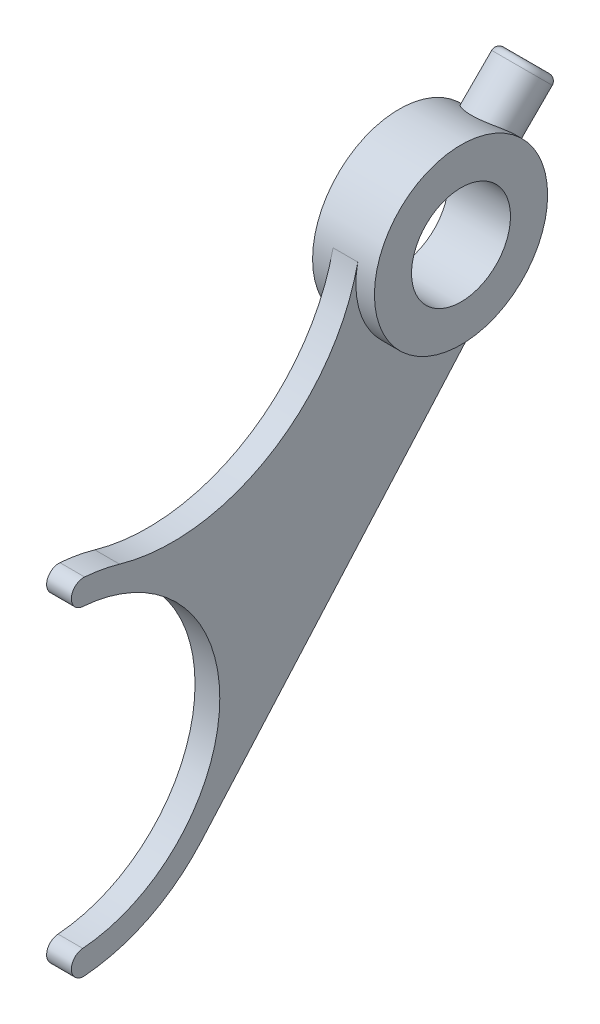
ISO-10303-21;
HEADER;
FILE_DESCRIPTION(('STEP AP214'),'2;1');
FILE_NAME('part.step','',(''),(''),'','','');
FILE_SCHEMA(('AUTOMOTIVE_DESIGN { 1 0 10303 214 1 1 1 1 }'));
ENDSEC;
DATA;
#1=APPLICATION_CONTEXT('core data for automotive mechanical design processes');
#2=APPLICATION_PROTOCOL_DEFINITION('international standard','automotive_design',2000,#1);
#3=PRODUCT_CONTEXT('',#1,'mechanical');
#4=PRODUCT('Part','Part','',(#3));
#5=PRODUCT_RELATED_PRODUCT_CATEGORY('part','',(#4));
#6=PRODUCT_DEFINITION_FORMATION('','',#4);
#7=PRODUCT_DEFINITION_CONTEXT('part definition',#1,'design');
#8=PRODUCT_DEFINITION('design','',#6,#7);
#9=PRODUCT_DEFINITION_SHAPE('','',#8);
#10=(LENGTH_UNIT() NAMED_UNIT(*) SI_UNIT(.MILLI.,.METRE.));
#11=(NAMED_UNIT(*) PLANE_ANGLE_UNIT() SI_UNIT($,.RADIAN.));
#12=(NAMED_UNIT(*) SI_UNIT($,.STERADIAN.) SOLID_ANGLE_UNIT());
#13=UNCERTAINTY_MEASURE_WITH_UNIT(LENGTH_MEASURE(1.E-05),#10,'distance_accuracy_value','');
#14=(GEOMETRIC_REPRESENTATION_CONTEXT(3) GLOBAL_UNCERTAINTY_ASSIGNED_CONTEXT((#13)) GLOBAL_UNIT_ASSIGNED_CONTEXT((#10,
#11,#12)) REPRESENTATION_CONTEXT('',''));
#15=CARTESIAN_POINT('',(0.,0.,0.));
#16=DIRECTION('',(0.,0.,1.));
#17=DIRECTION('',(1.,0.,0.));
#18=AXIS2_PLACEMENT_3D('',#15,#16,#17);
#19=CARTESIAN_POINT('',(1.2,11.9644443662914,-0.923076923076999));
#20=CARTESIAN_POINT('',(1.13333333333334,11.9644443662914,-0.923076923076999));
#21=CARTESIAN_POINT('',(1.06666666666665,11.9644443662914,-0.923076923077153));
#22=CARTESIAN_POINT('',(0.333333333333461,11.9644443662914,-0.923076923077153));
#23=CARTESIAN_POINT('',(-0.333333333333171,11.9644443662914,-0.923076923077153));
#24=CARTESIAN_POINT('',(-1.06666666666668,11.9644443662914,-0.923076923077153));
#25=CARTESIAN_POINT('',(-1.13333333333332,11.9644443662914,-0.923076923076999));
#26=CARTESIAN_POINT('',(-1.2,11.9644443662914,-0.923076923076999));
#27=CARTESIAN_POINT('',(1.2,12.0157264175735,-0.258385569394107));
#28=CARTESIAN_POINT('',(1.13333333333334,12.0157264175735,-0.258385569394085));
#29=CARTESIAN_POINT('',(1.06666666666666,12.0157264175734,-0.258385569394171));
#30=CARTESIAN_POINT('',(0.333333333333389,12.0157264175734,-0.25838556939437));
#31=CARTESIAN_POINT('',(-0.333333333333171,12.0157264175734,-0.258385569394189));
#32=CARTESIAN_POINT('',(-1.06666666666668,12.0157264175734,-0.258385569394189));
#33=CARTESIAN_POINT('',(-1.13333333333332,12.0157264175735,-0.258385569394107));
#34=CARTESIAN_POINT('',(-1.2,12.0157264175735,-0.258385569394107));
#35=CARTESIAN_POINT('',(1.2,12.5783474969382,0.534017084248035));
#36=CARTESIAN_POINT('',(1.1333333333333,12.5783474969383,0.534017084248104));
#37=CARTESIAN_POINT('',(1.0666666666667,12.5783474969382,0.534017084248246));
#38=CARTESIAN_POINT('',(0.333333333332955,12.5783474969376,0.534017084247451));
#39=CARTESIAN_POINT('',(-0.333333333333171,12.5783474969381,0.534017084248174));
#40=CARTESIAN_POINT('',(-1.06666666666668,12.5783474969381,0.534017084248174));
#41=CARTESIAN_POINT('',(-1.13333333333332,12.5783474969382,0.534017084248035));
#42=CARTESIAN_POINT('',(-1.2,12.5783474969382,0.534017084248035));
#43=CARTESIAN_POINT('',(1.2,13.5753845274625,0.457094007324937));
#44=CARTESIAN_POINT('',(1.13333333333324,13.5753845274627,0.457094007324946));
#45=CARTESIAN_POINT('',(1.06666666666679,13.5753845274629,0.45709400732505));
#46=CARTESIAN_POINT('',(0.333333333332088,13.575384527461,0.45709400732489));
#47=CARTESIAN_POINT('',(-0.333333333333171,13.5753845274627,0.457094007325035));
#48=CARTESIAN_POINT('',(-1.06666666666668,13.5753845274627,0.457094007325035));
#49=CARTESIAN_POINT('',(-1.13333333333332,13.5753845274625,0.457094007324937));
#50=CARTESIAN_POINT('',(-1.2,13.5753845274625,0.457094007324937));
#51=CARTESIAN_POINT('',(1.2,14.0098004786221,-0.412231723240295));
#52=CARTESIAN_POINT('',(1.13333333333321,14.0098004786222,-0.412231723240382));
#53=CARTESIAN_POINT('',(1.06666666666683,14.0098004786222,-0.412231723240533));
#54=CARTESIAN_POINT('',(0.333333333331654,14.0098004786216,-0.41223172323954));
#55=CARTESIAN_POINT('',(-0.333333333333171,14.0098004786222,-0.412231723240443));
#56=CARTESIAN_POINT('',(-1.06666666666668,14.0098004786222,-0.412231723240443));
#57=CARTESIAN_POINT('',(-1.13333333333332,14.0098004786221,-0.412231723240295));
#58=CARTESIAN_POINT('',(-1.2,14.0098004786221,-0.412231723240295));
#59=CARTESIAN_POINT('',(1.2,13.95851842734,-1.07692307692318));
#60=CARTESIAN_POINT('',(1.13333333333321,13.95851842734,-1.07692307692328));
#61=CARTESIAN_POINT('',(1.06666666666683,13.95851842734,-1.07692307692349));
#62=CARTESIAN_POINT('',(0.333333333331727,13.9585184273401,-1.07692307692238));
#63=CARTESIAN_POINT('',(-0.333333333333171,13.95851842734,-1.07692307692339));
#64=CARTESIAN_POINT('',(-1.06666666666668,13.95851842734,-1.07692307692339));
#65=CARTESIAN_POINT('',(-1.13333333333332,13.95851842734,-1.07692307692318));
#66=CARTESIAN_POINT('',(-1.2,13.95851842734,-1.07692307692318));
#67=(BOUNDED_SURFACE() B_SPLINE_SURFACE(5,3,((#19,#20,#21,#22,#23,#24,#25,#26),(#27,#28,#29,#30,
#31,#32,#33,#34),(#35,#36,#37,#38,#39,#40,#41,#42),(#43,#44,#45,#46,#47,#48,#49,#50),(#51,#52,
#53,#54,#55,#56,#57,#58),(#59,#60,#61,#62,#63,#64,#65,#66)),.UNSPECIFIED.,.F.,.F.,
.F.) B_SPLINE_SURFACE_WITH_KNOTS((6,6),(4,2,2,4),(0.,1.),(-0.1,0.,1.,1.1),
.UNSPECIFIED.) GEOMETRIC_REPRESENTATION_ITEM() RATIONAL_B_SPLINE_SURFACE(((1.,1.,1.,1.,1.,1.,1.,
1.),(0.599999999999976,0.599999999999976,0.599999999999927,0.599999999999927,0.599999999999927,
0.599999999999927,0.599999999999976,0.599999999999976),(0.399999999999964,0.399999999999964,
0.399999999999891,0.399999999999891,0.399999999999891,0.399999999999891,0.399999999999964,
0.399999999999964),(0.399999999999964,0.399999999999964,0.399999999999891,0.399999999999891,
0.399999999999891,0.399999999999891,0.399999999999964,0.399999999999964),(0.599999999999976,
0.599999999999976,0.599999999999927,0.599999999999927,0.599999999999927,0.599999999999927,
0.599999999999976,0.599999999999976),(1.,1.,1.,1.,1.,1.,1.,1.))) REPRESENTATION_ITEM('') SURFACE());
#68=CARTESIAN_POINT('',(-1.2,11.9644443662914,-0.923076923076999));
#69=CARTESIAN_POINT('',(-1.13333333333332,11.9644443662914,-0.923076923076999));
#70=CARTESIAN_POINT('',(-1.06666666666668,11.9644443662914,-0.923076923077153));
#71=CARTESIAN_POINT('',(-0.333333333333171,11.9644443662914,-0.923076923077153));
#72=CARTESIAN_POINT('',(0.333333333333461,11.9644443662914,-0.923076923077153));
#73=CARTESIAN_POINT('',(1.06666666666665,11.9644443662914,-0.923076923077153));
#74=CARTESIAN_POINT('',(1.13333333333334,11.9644443662914,-0.923076923076999));
#75=CARTESIAN_POINT('',(1.2,11.9644443662914,-0.923076923076999));
#76=(BOUNDED_CURVE() B_SPLINE_CURVE(3,(#68,#69,#70,#71,#72,#73,#74,#75),.UNSPECIFIED.,.F.,
.F.) B_SPLINE_CURVE_WITH_KNOTS((4,2,2,4),(-0.1,0.,1.,1.1),
.UNSPECIFIED.) CURVE() GEOMETRIC_REPRESENTATION_ITEM() RATIONAL_B_SPLINE_CURVE((1.,1.,1.,1.,1.,
1.,1.,1.)) REPRESENTATION_ITEM(''));
#77=CARTESIAN_POINT('',(1.,11.9644443662914,-0.923076923077153));
#78=VERTEX_POINT('',#77);
#79=CARTESIAN_POINT('',(-1.,11.9644443662914,-0.923076923077153));
#80=VERTEX_POINT('',#79);
#81=EDGE_CURVE('E435',#78,#80,#76,.F.);
#82=CARTESIAN_POINT('',(1.,11.9644443662914,-0.923076923077153));
#83=CARTESIAN_POINT('',(1.,12.0157264175734,-0.258385569394189));
#84=CARTESIAN_POINT('',(1.,12.5783474969381,0.534017084248174));
#85=CARTESIAN_POINT('',(1.,13.5753845274627,0.457094007325035));
#86=CARTESIAN_POINT('',(1.,14.0098004786222,-0.412231723240443));
#87=CARTESIAN_POINT('',(1.,13.95851842734,-1.07692307692339));
#88=(BOUNDED_CURVE() B_SPLINE_CURVE(5,(#82,#83,#84,#85,#86,#87),.UNSPECIFIED.,.F.,
.F.) B_SPLINE_CURVE_WITH_KNOTS((6,6),(0.,1.),
.UNSPECIFIED.) CURVE() GEOMETRIC_REPRESENTATION_ITEM() RATIONAL_B_SPLINE_CURVE((1.,
0.599999999999927,0.399999999999891,0.399999999999891,0.599999999999927,1.)) REPRESENTATION_ITEM(''));
#89=CARTESIAN_POINT('',(1.,13.95851842734,-1.07692307692339));
#90=VERTEX_POINT('',#89);
#91=EDGE_CURVE('E197',#90,#78,#88,.F.);
#92=CARTESIAN_POINT('',(1.2,13.95851842734,-1.07692307692318));
#93=CARTESIAN_POINT('',(1.13333333333321,13.95851842734,-1.07692307692328));
#94=CARTESIAN_POINT('',(1.06666666666683,13.95851842734,-1.07692307692349));
#95=CARTESIAN_POINT('',(0.333333333331727,13.9585184273401,-1.07692307692238));
#96=CARTESIAN_POINT('',(-0.333333333333171,13.95851842734,-1.07692307692339));
#97=CARTESIAN_POINT('',(-1.06666666666668,13.95851842734,-1.07692307692339));
#98=CARTESIAN_POINT('',(-1.13333333333332,13.95851842734,-1.07692307692318));
#99=CARTESIAN_POINT('',(-1.2,13.95851842734,-1.07692307692318));
#100=(BOUNDED_CURVE() B_SPLINE_CURVE(3,(#92,#93,#94,#95,#96,#97,#98,#99),.UNSPECIFIED.,.F.,
.F.) B_SPLINE_CURVE_WITH_KNOTS((4,2,2,4),(-0.1,0.,1.,1.1),
.UNSPECIFIED.) CURVE() GEOMETRIC_REPRESENTATION_ITEM() RATIONAL_B_SPLINE_CURVE((1.,1.,1.,1.,1.,
1.,1.,1.)) REPRESENTATION_ITEM(''));
#101=CARTESIAN_POINT('',(-1.,13.95851842734,-1.07692307692339));
#102=VERTEX_POINT('',#101);
#103=EDGE_CURVE('E434',#102,#90,#100,.F.);
#104=CARTESIAN_POINT('',(-1.,13.95851842734,-1.07692307692339));
#105=CARTESIAN_POINT('',(-1.,14.0098004786222,-0.412231723240443));
#106=CARTESIAN_POINT('',(-1.,13.5753845274627,0.457094007325035));
#107=CARTESIAN_POINT('',(-1.,12.5783474969381,0.534017084248174));
#108=CARTESIAN_POINT('',(-1.,12.0157264175734,-0.258385569394189));
#109=CARTESIAN_POINT('',(-1.,11.9644443662914,-0.923076923077153));
#110=(BOUNDED_CURVE() B_SPLINE_CURVE(5,(#104,#105,#106,#107,#108,#109),.UNSPECIFIED.,.F.,
.F.) B_SPLINE_CURVE_WITH_KNOTS((6,6),(0.,1.),
.UNSPECIFIED.) CURVE() GEOMETRIC_REPRESENTATION_ITEM() RATIONAL_B_SPLINE_CURVE((1.,
0.599999999999927,0.399999999999891,0.399999999999891,0.599999999999927,1.)) REPRESENTATION_ITEM(''));
#111=EDGE_CURVE('E12',#80,#102,#110,.F.);
#112=ORIENTED_EDGE('',*,*,#81,.F.);
#113=ORIENTED_EDGE('',*,*,#91,.F.);
#114=ORIENTED_EDGE('',*,*,#103,.F.);
#115=ORIENTED_EDGE('',*,*,#111,.F.);
#116=EDGE_LOOP('',(#112,#113,#114,#115));
#117=FACE_BOUND('',#116,.T.);
#118=ADVANCED_FACE('F181',(#117),#67,.T.);
#119=CARTESIAN_POINT('',(1.2,-13.95851842734,-1.07692307692308));
#120=CARTESIAN_POINT('',(1.13333333333334,-13.95851842734,-1.07692307692308));
#121=CARTESIAN_POINT('',(1.06666666666665,-13.95851842734,-1.07692307692308));
#122=CARTESIAN_POINT('',(0.333333333333461,-13.95851842734,-1.07692307692308));
#123=CARTESIAN_POINT('',(-0.333333333333171,-13.95851842734,-1.07692307692308));
#124=CARTESIAN_POINT('',(-1.06666666666668,-13.95851842734,-1.07692307692308));
#125=CARTESIAN_POINT('',(-1.13333333333332,-13.95851842734,-1.07692307692308));
#126=CARTESIAN_POINT('',(-1.2,-13.95851842734,-1.07692307692308));
#127=CARTESIAN_POINT('',(1.2,-14.0098004786221,-0.412231723240223));
#128=CARTESIAN_POINT('',(1.13333333333334,-14.0098004786221,-0.412231723240223));
#129=CARTESIAN_POINT('',(1.06666666666665,-14.0098004786221,-0.412231723240223));
#130=CARTESIAN_POINT('',(0.333333333333461,-14.0098004786221,-0.412231723240223));
#131=CARTESIAN_POINT('',(-0.333333333333171,-14.0098004786221,-0.412231723240223));
#132=CARTESIAN_POINT('',(-1.06666666666668,-14.0098004786221,-0.412231723240223));
#133=CARTESIAN_POINT('',(-1.13333333333332,-14.0098004786221,-0.412231723240223));
#134=CARTESIAN_POINT('',(-1.2,-14.0098004786221,-0.412231723240223));
#135=CARTESIAN_POINT('',(1.2,-13.5753845274625,0.457094007324897));
#136=CARTESIAN_POINT('',(1.13333333333334,-13.5753845274625,0.457094007324897));
#137=CARTESIAN_POINT('',(1.06666666666665,-13.5753845274625,0.457094007324897));
#138=CARTESIAN_POINT('',(0.333333333333461,-13.5753845274625,0.457094007324897));
#139=CARTESIAN_POINT('',(-0.333333333333171,-13.5753845274625,0.457094007324897));
#140=CARTESIAN_POINT('',(-1.06666666666668,-13.5753845274625,0.457094007324897));
#141=CARTESIAN_POINT('',(-1.13333333333332,-13.5753845274625,0.457094007324897));
#142=CARTESIAN_POINT('',(-1.2,-13.5753845274625,0.457094007324897));
#143=CARTESIAN_POINT('',(1.2,-12.5783474969382,0.534017084247975));
#144=CARTESIAN_POINT('',(1.13333333333334,-12.5783474969382,0.534017084247975));
#145=CARTESIAN_POINT('',(1.06666666666665,-12.5783474969382,0.534017084247975));
#146=CARTESIAN_POINT('',(0.333333333333461,-12.5783474969382,0.534017084247975));
#147=CARTESIAN_POINT('',(-0.333333333333171,-12.5783474969382,0.534017084247975));
#148=CARTESIAN_POINT('',(-1.06666666666668,-12.5783474969382,0.534017084247975));
#149=CARTESIAN_POINT('',(-1.13333333333332,-12.5783474969382,0.534017084247975));
#150=CARTESIAN_POINT('',(-1.2,-12.5783474969382,0.534017084247975));
#151=CARTESIAN_POINT('',(1.2,-12.0157264175735,-0.258385569394068));
#152=CARTESIAN_POINT('',(1.13333333333334,-12.0157264175735,-0.258385569394068));
#153=CARTESIAN_POINT('',(1.06666666666665,-12.0157264175735,-0.258385569394068));
#154=CARTESIAN_POINT('',(0.333333333333461,-12.0157264175735,-0.258385569394068));
#155=CARTESIAN_POINT('',(-0.333333333333171,-12.0157264175735,-0.258385569394068));
#156=CARTESIAN_POINT('',(-1.06666666666668,-12.0157264175735,-0.258385569394068));
#157=CARTESIAN_POINT('',(-1.13333333333332,-12.0157264175735,-0.258385569394068));
#158=CARTESIAN_POINT('',(-1.2,-12.0157264175735,-0.258385569394068));
#159=CARTESIAN_POINT('',(1.2,-11.9644443662914,-0.923076923076928));
#160=CARTESIAN_POINT('',(1.13333333333334,-11.9644443662914,-0.923076923076928));
#161=CARTESIAN_POINT('',(1.06666666666665,-11.9644443662914,-0.923076923076928));
#162=CARTESIAN_POINT('',(0.333333333333461,-11.9644443662914,-0.923076923076928));
#163=CARTESIAN_POINT('',(-0.333333333333171,-11.9644443662914,-0.923076923076928));
#164=CARTESIAN_POINT('',(-1.06666666666668,-11.9644443662914,-0.923076923076928));
#165=CARTESIAN_POINT('',(-1.13333333333332,-11.9644443662914,-0.923076923076928));
#166=CARTESIAN_POINT('',(-1.2,-11.9644443662914,-0.923076923076928));
#167=(BOUNDED_SURFACE() B_SPLINE_SURFACE(5,3,((#119,#120,#121,#122,#123,#124,#125,#126),(#127,
#128,#129,#130,#131,#132,#133,#134),(#135,#136,#137,#138,#139,#140,#141,#142),(#143,#144,#145,
#146,#147,#148,#149,#150),(#151,#152,#153,#154,#155,#156,#157,#158),(#159,#160,#161,#162,#163,
#164,#165,#166)),.UNSPECIFIED.,.F.,.F.,.F.) B_SPLINE_SURFACE_WITH_KNOTS((6,6),(4,2,2,4),(0.,1.),
(-0.1,0.,1.,1.1),.UNSPECIFIED.) GEOMETRIC_REPRESENTATION_ITEM() RATIONAL_B_SPLINE_SURFACE(((1.,
1.,1.,1.,1.,1.,1.,1.),(0.599999999999998,0.599999999999998,0.599999999999998,0.599999999999998,
0.599999999999998,0.599999999999998,0.599999999999998,0.599999999999998),(0.399999999999997,
0.399999999999997,0.399999999999997,0.399999999999997,0.399999999999997,0.399999999999997,
0.399999999999997,0.399999999999997),(0.399999999999997,0.399999999999997,0.399999999999997,
0.399999999999997,0.399999999999997,0.399999999999997,0.399999999999997,0.399999999999997),
(0.599999999999998,0.599999999999998,0.599999999999998,0.599999999999998,0.599999999999998,
0.599999999999998,0.599999999999998,0.599999999999998),(1.,1.,1.,1.,1.,1.,1.,1.))) REPRESENTATION_ITEM('') SURFACE());
#168=CARTESIAN_POINT('',(-1.2,-13.95851842734,-1.07692307692308));
#169=CARTESIAN_POINT('',(-1.13333333333332,-13.95851842734,-1.07692307692308));
#170=CARTESIAN_POINT('',(-1.06666666666668,-13.95851842734,-1.07692307692308));
#171=CARTESIAN_POINT('',(-0.333333333333171,-13.95851842734,-1.07692307692308));
#172=CARTESIAN_POINT('',(0.333333333333461,-13.95851842734,-1.07692307692308));
#173=CARTESIAN_POINT('',(1.06666666666665,-13.95851842734,-1.07692307692308));
#174=CARTESIAN_POINT('',(1.13333333333334,-13.95851842734,-1.07692307692308));
#175=CARTESIAN_POINT('',(1.2,-13.95851842734,-1.07692307692308));
#176=(BOUNDED_CURVE() B_SPLINE_CURVE(3,(#168,#169,#170,#171,#172,#173,#174,#175),.UNSPECIFIED.,
.F.,.F.) B_SPLINE_CURVE_WITH_KNOTS((4,2,2,4),(-0.1,0.,1.,1.1),
.UNSPECIFIED.) CURVE() GEOMETRIC_REPRESENTATION_ITEM() RATIONAL_B_SPLINE_CURVE((1.,1.,1.,1.,1.,
1.,1.,1.)) REPRESENTATION_ITEM(''));
#177=CARTESIAN_POINT('',(1.,-13.95851842734,-1.07692307692308));
#178=VERTEX_POINT('',#177);
#179=CARTESIAN_POINT('',(-1.,-13.95851842734,-1.07692307692308));
#180=VERTEX_POINT('',#179);
#181=EDGE_CURVE('E305',#178,#180,#176,.F.);
#182=CARTESIAN_POINT('',(1.,-13.95851842734,-1.07692307692308));
#183=CARTESIAN_POINT('',(1.,-14.0098004786221,-0.412231723240223));
#184=CARTESIAN_POINT('',(1.,-13.5753845274625,0.457094007324897));
#185=CARTESIAN_POINT('',(1.,-12.5783474969382,0.534017084247975));
#186=CARTESIAN_POINT('',(1.,-12.0157264175735,-0.258385569394068));
#187=CARTESIAN_POINT('',(1.,-11.9644443662914,-0.923076923076928));
#188=(BOUNDED_CURVE() B_SPLINE_CURVE(5,(#182,#183,#184,#185,#186,#187),.UNSPECIFIED.,.F.,
.F.) B_SPLINE_CURVE_WITH_KNOTS((6,6),(0.,1.),
.UNSPECIFIED.) CURVE() GEOMETRIC_REPRESENTATION_ITEM() RATIONAL_B_SPLINE_CURVE((1.,
0.599999999999998,0.399999999999997,0.399999999999997,0.599999999999998,1.)) REPRESENTATION_ITEM(''));
#189=CARTESIAN_POINT('',(1.,-11.9644443662914,-0.923076923076928));
#190=VERTEX_POINT('',#189);
#191=EDGE_CURVE('E704',#190,#178,#188,.F.);
#192=CARTESIAN_POINT('',(1.2,-11.9644443662914,-0.923076923076928));
#193=CARTESIAN_POINT('',(1.13333333333334,-11.9644443662914,-0.923076923076928));
#194=CARTESIAN_POINT('',(1.06666666666665,-11.9644443662914,-0.923076923076928));
#195=CARTESIAN_POINT('',(0.333333333333461,-11.9644443662914,-0.923076923076928));
#196=CARTESIAN_POINT('',(-0.333333333333171,-11.9644443662914,-0.923076923076928));
#197=CARTESIAN_POINT('',(-1.06666666666668,-11.9644443662914,-0.923076923076928));
#198=CARTESIAN_POINT('',(-1.13333333333332,-11.9644443662914,-0.923076923076928));
#199=CARTESIAN_POINT('',(-1.2,-11.9644443662914,-0.923076923076928));
#200=(BOUNDED_CURVE() B_SPLINE_CURVE(3,(#192,#193,#194,#195,#196,#197,#198,#199),.UNSPECIFIED.,
.F.,.F.) B_SPLINE_CURVE_WITH_KNOTS((4,2,2,4),(-0.1,0.,1.,1.1),
.UNSPECIFIED.) CURVE() GEOMETRIC_REPRESENTATION_ITEM() RATIONAL_B_SPLINE_CURVE((1.,1.,1.,1.,1.,
1.,1.,1.)) REPRESENTATION_ITEM(''));
#201=CARTESIAN_POINT('',(-1.,-11.9644443662914,-0.923076923076928));
#202=VERTEX_POINT('',#201);
#203=EDGE_CURVE('E361',#202,#190,#200,.F.);
#204=CARTESIAN_POINT('',(-1.,-11.9644443662914,-0.923076923076928));
#205=CARTESIAN_POINT('',(-1.,-12.0157264175735,-0.258385569394068));
#206=CARTESIAN_POINT('',(-1.,-12.5783474969382,0.534017084247975));
#207=CARTESIAN_POINT('',(-1.,-13.5753845274625,0.457094007324897));
#208=CARTESIAN_POINT('',(-1.,-14.0098004786221,-0.412231723240223));
#209=CARTESIAN_POINT('',(-1.,-13.95851842734,-1.07692307692308));
#210=(BOUNDED_CURVE() B_SPLINE_CURVE(5,(#204,#205,#206,#207,#208,#209),.UNSPECIFIED.,.F.,
.F.) B_SPLINE_CURVE_WITH_KNOTS((6,6),(0.,1.),
.UNSPECIFIED.) CURVE() GEOMETRIC_REPRESENTATION_ITEM() RATIONAL_B_SPLINE_CURVE((1.,
0.599999999999998,0.399999999999997,0.399999999999997,0.599999999999998,1.)) REPRESENTATION_ITEM(''));
#211=EDGE_CURVE('E421',#180,#202,#210,.F.);
#212=ORIENTED_EDGE('',*,*,#181,.F.);
#213=ORIENTED_EDGE('',*,*,#191,.F.);
#214=ORIENTED_EDGE('',*,*,#203,.F.);
#215=ORIENTED_EDGE('',*,*,#211,.F.);
#216=EDGE_LOOP('',(#212,#213,#214,#215));
#217=FACE_BOUND('',#216,.T.);
#218=ADVANCED_FACE('F389',(#217),#167,.T.);
#219=CARTESIAN_POINT('',(2.,34.5281745930521,-34.528174593052));
#220=DIRECTION('',(0.,0.707106781186549,-0.707106781186546));
#221=DIRECTION('',(0.,0.707106781186546,0.707106781186549));
#222=AXIS2_PLACEMENT_3D('',#219,#220,#221);
#223=PLANE('',#222);
#224=CARTESIAN_POINT('',(0.,31.278174593052,-37.778174593052));
#225=DIRECTION('',(0.,0.707106781186549,-0.707106781186546));
#226=DIRECTION('',(0.,0.707106781186546,0.707106781186549));
#227=AXIS2_PLACEMENT_3D('',#224,#225,#226);
#228=CIRCLE('',#227,1.5);
#229=CARTESIAN_POINT('',(0.,32.3388347648319,-36.7175144212722));
#230=VERTEX_POINT('',#229);
#231=EDGE_CURVE('E299',#230,#230,#228,.T.);
#232=ORIENTED_EDGE('',*,*,#231,.T.);
#233=EDGE_LOOP('',(#232));
#234=FACE_BOUND('',#233,.T.);
#235=ADVANCED_FACE('F377',(#234),#223,.T.);
#236=CARTESIAN_POINT('',(1.,0.,0.));
#237=DIRECTION('',(-1.,0.,0.));
#238=DIRECTION('',(0.,0.,1.));
#239=AXIS2_PLACEMENT_3D('',#236,#237,#238);
#240=CYLINDRICAL_SURFACE('',#239,12.);
#241=CARTESIAN_POINT('',(1.,0.,0.));
#242=DIRECTION('',(1.,0.,0.));
#243=DIRECTION('',(0.,0.,-1.));
#244=AXIS2_PLACEMENT_3D('',#241,#242,#243);
#245=CIRCLE('',#244,12.);
#246=EDGE_CURVE('E285',#190,#78,#245,.T.);
#247=ORIENTED_EDGE('',*,*,#246,.T.);
#248=ORIENTED_EDGE('',*,*,#81,.T.);
#249=CARTESIAN_POINT('',(-1.,0.,0.));
#250=DIRECTION('',(1.,0.,0.));
#251=DIRECTION('',(0.,0.,-1.));
#252=AXIS2_PLACEMENT_3D('',#249,#250,#251);
#253=CIRCLE('',#252,12.);
#254=EDGE_CURVE('E309',#202,#80,#253,.T.);
#255=ORIENTED_EDGE('',*,*,#254,.F.);
#256=ORIENTED_EDGE('',*,*,#203,.T.);
#257=EDGE_LOOP('',(#247,#248,#255,#256));
#258=FACE_BOUND('',#257,.T.);
#259=ADVANCED_FACE('F366',(#258),#240,.F.);
#260=CARTESIAN_POINT('',(1.,0.,0.));
#261=DIRECTION('',(-1.,0.,0.));
#262=DIRECTION('',(0.,0.,1.));
#263=AXIS2_PLACEMENT_3D('',#260,#261,#262);
#264=CYLINDRICAL_SURFACE('',#263,14.);
#265=CARTESIAN_POINT('',(1.,0.,0.));
#266=DIRECTION('',(1.,0.,0.));
#267=DIRECTION('',(0.,0.,-1.));
#268=AXIS2_PLACEMENT_3D('',#265,#266,#267);
#269=CIRCLE('',#268,14.);
#270=CARTESIAN_POINT('',(1.,-9.24785059764497,-10.5108163014886));
#271=VERTEX_POINT('',#270);
#272=EDGE_CURVE('E313',#178,#271,#269,.T.);
#273=ORIENTED_EDGE('',*,*,#272,.F.);
#274=ORIENTED_EDGE('',*,*,#181,.T.);
#275=CARTESIAN_POINT('',(-1.,0.,0.));
#276=DIRECTION('',(1.,0.,0.));
#277=DIRECTION('',(0.,0.,-1.));
#278=AXIS2_PLACEMENT_3D('',#275,#276,#277);
#279=CIRCLE('',#278,14.);
#280=CARTESIAN_POINT('',(-1.,-9.24785059764497,-10.5108163014886));
#281=VERTEX_POINT('',#280);
#282=EDGE_CURVE('E308',#180,#281,#279,.T.);
#283=ORIENTED_EDGE('',*,*,#282,.T.);
#284=DIRECTION('',(-1.,0.,0.));
#285=VECTOR('',#284,1.);
#286=CARTESIAN_POINT('',(1.,-9.24785059764497,-10.5108163014886));
#287=LINE('',#286,#285);
#288=EDGE_CURVE('E291',#271,#281,#287,.T.);
#289=ORIENTED_EDGE('',*,*,#288,.F.);
#290=EDGE_LOOP('',(#273,#274,#283,#289));
#291=FACE_BOUND('',#290,.T.);
#292=ADVANCED_FACE('F378',(#291),#264,.T.);
#293=CARTESIAN_POINT('',(1.,-9.24785059764496,-10.5108163014886));
#294=DIRECTION('',(0.,-0.66056075697464,-0.750772592963469));
#295=DIRECTION('',(0.,0.750772592963469,-0.66056075697464));
#296=AXIS2_PLACEMENT_3D('',#293,#294,#295);
#297=PLANE('',#296);
#298=DIRECTION('',(0.,-0.750772592963469,0.66056075697464));
#299=VECTOR('',#298,1.);
#300=CARTESIAN_POINT('',(-1.,-9.24785059764496,-10.5108163014886));
#301=LINE('',#300,#299);
#302=CARTESIAN_POINT('',(-1.,18.8760747011775,-35.2554081507443));
#303=VERTEX_POINT('',#302);
#304=EDGE_CURVE('E266',#303,#281,#301,.T.);
#305=ORIENTED_EDGE('',*,*,#304,.F.);
#306=DIRECTION('',(-1.,0.,0.));
#307=VECTOR('',#306,1.);
#308=CARTESIAN_POINT('',(1.,18.8760747011775,-35.2554081507443));
#309=LINE('',#308,#307);
#310=CARTESIAN_POINT('',(1.,18.8760747011775,-35.2554081507443));
#311=VERTEX_POINT('',#310);
#312=EDGE_CURVE('E257',#311,#303,#309,.T.);
#313=ORIENTED_EDGE('',*,*,#312,.F.);
#314=DIRECTION('',(0.,-0.750772592963469,0.66056075697464));
#315=VECTOR('',#314,1.);
#316=CARTESIAN_POINT('',(1.,-9.24785059764496,-10.5108163014886));
#317=LINE('',#316,#315);
#318=EDGE_CURVE('E331',#311,#271,#317,.T.);
#319=ORIENTED_EDGE('',*,*,#318,.T.);
#320=ORIENTED_EDGE('',*,*,#288,.T.);
#321=EDGE_LOOP('',(#305,#313,#319,#320));
#322=FACE_BOUND('',#321,.T.);
#323=ADVANCED_FACE('F379',(#322),#297,.T.);
#324=CARTESIAN_POINT('',(1.,28.1708775690041,-8.16397923761349));
#325=DIRECTION('',(-1.,0.,0.));
#326=DIRECTION('',(0.,0.,1.));
#327=AXIS2_PLACEMENT_3D('',#324,#325,#326);
#328=CYLINDRICAL_SURFACE('',#327,15.33);
#329=CARTESIAN_POINT('',(-1.,28.1708775690041,-8.16397923761349));
#330=DIRECTION('',(1.,0.,0.));
#331=DIRECTION('',(0.,0.,-1.));
#332=AXIS2_PLACEMENT_3D('',#329,#330,#331);
#333=CIRCLE('',#332,15.33);
#334=CARTESIAN_POINT('',(-1.,13.4467196033432,-3.89688746425465));
#335=VERTEX_POINT('',#334);
#336=CARTESIAN_POINT('',(-1.,24.9642249432615,-23.1548524255842));
#337=VERTEX_POINT('',#336);
#338=EDGE_CURVE('E264',#335,#337,#333,.T.);
#339=ORIENTED_EDGE('',*,*,#338,.F.);
#340=DIRECTION('',(-1.,0.,0.));
#341=VECTOR('',#340,1.);
#342=CARTESIAN_POINT('',(1.,13.4467196033432,-3.89688746425465));
#343=LINE('',#342,#341);
#344=CARTESIAN_POINT('',(1.,13.4467196033432,-3.89688746425465));
#345=VERTEX_POINT('',#344);
#346=EDGE_CURVE('E274',#345,#335,#343,.T.);
#347=ORIENTED_EDGE('',*,*,#346,.F.);
#348=CARTESIAN_POINT('',(1.,28.1708775690041,-8.16397923761349));
#349=DIRECTION('',(1.,0.,0.));
#350=DIRECTION('',(0.,0.,-1.));
#351=AXIS2_PLACEMENT_3D('',#348,#349,#350);
#352=CIRCLE('',#351,15.33);
#353=CARTESIAN_POINT('',(1.,24.9642249432615,-23.1548524255842));
#354=VERTEX_POINT('',#353);
#355=EDGE_CURVE('E272',#345,#354,#352,.T.);
#356=ORIENTED_EDGE('',*,*,#355,.T.);
#357=DIRECTION('',(-1.,0.,0.));
#358=VECTOR('',#357,1.);
#359=CARTESIAN_POINT('',(1.,24.9642249432615,-23.1548524255842));
#360=LINE('',#359,#358);
#361=EDGE_CURVE('E260',#354,#337,#360,.T.);
#362=ORIENTED_EDGE('',*,*,#361,.T.);
#363=EDGE_LOOP('',(#339,#347,#356,#362));
#364=FACE_BOUND('',#363,.T.);
#365=ADVANCED_FACE('F271',(#364),#328,.F.);
#366=EDGE_CURVE('E276',#335,#102,#279,.T.);
#367=ORIENTED_EDGE('',*,*,#366,.T.);
#368=ORIENTED_EDGE('',*,*,#103,.T.);
#369=EDGE_CURVE('E286',#345,#90,#269,.T.);
#370=ORIENTED_EDGE('',*,*,#369,.F.);
#371=ORIENTED_EDGE('',*,*,#346,.T.);
#372=EDGE_LOOP('',(#367,#368,#370,#371));
#373=FACE_BOUND('',#372,.T.);
#374=ADVANCED_FACE('F503',(#373),#264,.T.);
#375=CARTESIAN_POINT('',(1.,0.,0.));
#376=DIRECTION('',(1.,0.,0.));
#377=DIRECTION('',(0.,0.,-1.));
#378=AXIS2_PLACEMENT_3D('',#375,#376,#377);
#379=PLANE('',#378);
#380=ORIENTED_EDGE('',*,*,#369,.T.);
#381=ORIENTED_EDGE('',*,*,#91,.T.);
#382=ORIENTED_EDGE('',*,*,#246,.F.);
#383=ORIENTED_EDGE('',*,*,#191,.T.);
#384=ORIENTED_EDGE('',*,*,#272,.T.);
#385=ORIENTED_EDGE('',*,*,#318,.F.);
#386=CARTESIAN_POINT('',(1.,23.5,-30.));
#387=DIRECTION('',(1.,0.,0.));
#388=DIRECTION('',(0.,0.,-1.));
#389=AXIS2_PLACEMENT_3D('',#386,#387,#388);
#390=CIRCLE('',#389,7.);
#391=EDGE_CURVE('E340',#354,#311,#390,.T.);
#392=ORIENTED_EDGE('',*,*,#391,.F.);
#393=ORIENTED_EDGE('',*,*,#355,.F.);
#394=EDGE_LOOP('',(#380,#381,#382,#383,#384,#385,#392,#393));
#395=FACE_BOUND('',#394,.T.);
#396=ADVANCED_FACE('F529',(#395),#379,.T.);
#397=CARTESIAN_POINT('',(-1.,0.,0.));
#398=DIRECTION('',(1.,0.,0.));
#399=DIRECTION('',(0.,0.,-1.));
#400=AXIS2_PLACEMENT_3D('',#397,#398,#399);
#401=PLANE('',#400);
#402=ORIENTED_EDGE('',*,*,#254,.T.);
#403=ORIENTED_EDGE('',*,*,#111,.T.);
#404=ORIENTED_EDGE('',*,*,#366,.F.);
#405=ORIENTED_EDGE('',*,*,#338,.T.);
#406=CARTESIAN_POINT('',(-1.,23.5,-30.));
#407=DIRECTION('',(1.,0.,0.));
#408=DIRECTION('',(0.,0.,-1.));
#409=AXIS2_PLACEMENT_3D('',#406,#407,#408);
#410=CIRCLE('',#409,7.);
#411=EDGE_CURVE('E251',#337,#303,#410,.T.);
#412=ORIENTED_EDGE('',*,*,#411,.T.);
#413=ORIENTED_EDGE('',*,*,#304,.T.);
#414=ORIENTED_EDGE('',*,*,#282,.F.);
#415=ORIENTED_EDGE('',*,*,#211,.T.);
#416=EDGE_LOOP('',(#402,#403,#404,#405,#412,#413,#414,#415));
#417=FACE_BOUND('',#416,.T.);
#418=ADVANCED_FACE('F280',(#417),#401,.F.);
#419=CARTESIAN_POINT('',(2.5,23.5,-30.));
#420=DIRECTION('',(-1.,0.,0.));
#421=DIRECTION('',(0.,0.,1.));
#422=AXIS2_PLACEMENT_3D('',#419,#420,#421);
#423=CYLINDRICAL_SURFACE('',#422,7.);
#424=CARTESIAN_POINT('',(0.,26.8292029278795,-36.1576300526257));
#425=CARTESIAN_POINT('',(-0.109798327909197,26.8292088896615,-36.1576292082063));
#426=CARTESIAN_POINT('',(-0.219656596714845,26.8375495943944,-36.1531398032426));
#427=CARTESIAN_POINT('',(-0.436218890985227,26.8704668454411,-36.13516827451));
#428=CARTESIAN_POINT('',(-0.542919807233931,26.8950588735623,-36.1216775755486));
#429=CARTESIAN_POINT('',(-0.749942542077982,26.9591077144871,-36.0857136454196));
#430=CARTESIAN_POINT('',(-0.850275201173564,26.9985384290175,-36.0632561807888));
#431=CARTESIAN_POINT('',(-1.0421805687615,27.0903597730482,-36.009337669824));
#432=CARTESIAN_POINT('',(-1.13375341090508,27.1427502047743,-35.9778767608876));
#433=CARTESIAN_POINT('',(-1.30818247611349,27.2597464196862,-35.9050120403426));
#434=CARTESIAN_POINT('',(-1.3907509590942,27.3246338256799,-35.8633714712712));
#435=CARTESIAN_POINT('',(-1.5422889067552,27.4630704938406,-35.7707018233313));
#436=CARTESIAN_POINT('',(-1.61125402376376,27.5366225132835,-35.7196697529545));
#437=CARTESIAN_POINT('',(-1.73485884638037,27.6910490739716,-35.6075286282615));
#438=CARTESIAN_POINT('',(-1.78920164893488,27.772036143774,-35.5462466184366));
#439=CARTESIAN_POINT('',(-1.88003889612309,27.936984820146,-35.4151836699498));
#440=CARTESIAN_POINT('',(-1.91655417994638,28.0209428301092,-35.3454127740424));
#441=CARTESIAN_POINT('',(-1.96225189719719,28.1630027554465,-35.2213408764839));
#442=CARTESIAN_POINT('',(-1.97638135477614,28.2211432211303,-35.1688518686426));
#443=CARTESIAN_POINT('',(-1.99525689206356,28.3364190597968,-35.0611531776165));
#444=CARTESIAN_POINT('',(-2.00000341991351,28.3935544806527,-35.0059436244978));
#445=CARTESIAN_POINT('',(-1.99999527056735,28.5274573137919,-34.8720332410157));
#446=CARTESIAN_POINT('',(-1.99090655049294,28.6033648122166,-34.7924321944318));
#447=CARTESIAN_POINT('',(-1.95485140508047,28.7494565362292,-34.6319558592289));
#448=CARTESIAN_POINT('',(-1.9278683310792,28.8196353635859,-34.5510794525042));
#449=CARTESIAN_POINT('',(-1.85698936495006,28.9525823203524,-34.3909184329583));
#450=CARTESIAN_POINT('',(-1.81312059229676,29.0153621229469,-34.3116314811034));
#451=CARTESIAN_POINT('',(-1.70981393173114,29.1326567067018,-34.1572336242886));
#452=CARTESIAN_POINT('',(-1.65037652448163,29.187171742945,-34.0821225904891));
#453=CARTESIAN_POINT('',(-1.51597207071943,29.2886124788371,-33.9370033692145));
#454=CARTESIAN_POINT('',(-1.44067127837824,29.335328427356,-33.8671576811296));
#455=CARTESIAN_POINT('',(-1.2773693853038,29.4193521691305,-33.7372807652848));
#456=CARTESIAN_POINT('',(-1.18936382050679,29.4566566427732,-33.6772530031193));
#457=CARTESIAN_POINT('',(-1.00096236511539,29.5224643991058,-33.5684809952648));
#458=CARTESIAN_POINT('',(-0.900349507000974,29.5507716387768,-33.5199932103646));
#459=CARTESIAN_POINT('',(-0.691009595860087,29.5975178379199,-33.4383875449196));
#460=CARTESIAN_POINT('',(-0.582292419980775,29.6159685929719,-33.4052512990187));
#461=CARTESIAN_POINT('',(-0.394206491829477,29.6388910528872,-33.3636853066215));
#462=CARTESIAN_POINT('',(-0.316100246547247,29.6459171897675,-33.3507907149962));
#463=CARTESIAN_POINT('',(-0.158673058011847,29.6552868641085,-33.3335476097787));
#464=CARTESIAN_POINT('',(-0.0793521827972713,29.6576306628947,-33.3291986192491));
#465=CARTESIAN_POINT('',(0.109798327909197,29.6576292082063,-33.3292088896614));
#466=CARTESIAN_POINT('',(0.219656596714846,29.6531398032426,-33.3375495943943));
#467=CARTESIAN_POINT('',(0.436218890985229,29.6351682745101,-33.370466845441));
#468=CARTESIAN_POINT('',(0.542919807233931,29.6216775755486,-33.3950588735623));
#469=CARTESIAN_POINT('',(0.749942542077984,29.5857136454197,-33.4591077144871));
#470=CARTESIAN_POINT('',(0.85027520117357,29.5632561807888,-33.4985384290175));
#471=CARTESIAN_POINT('',(1.0421805687615,29.509337669824,-33.5903597730482));
#472=CARTESIAN_POINT('',(1.13375341090509,29.4778767608876,-33.6427502047743));
#473=CARTESIAN_POINT('',(1.30818247611349,29.4050120403427,-33.7597464196862));
#474=CARTESIAN_POINT('',(1.39075095909421,29.3633714712713,-33.8246338256798));
#475=CARTESIAN_POINT('',(1.54228890675521,29.2707018233313,-33.9630704938405));
#476=CARTESIAN_POINT('',(1.61125402376377,29.2196697529546,-34.0366225132835));
#477=CARTESIAN_POINT('',(1.73485884638037,29.1075286282615,-34.1910490739716));
#478=CARTESIAN_POINT('',(1.78920164893488,29.0462466184366,-34.2720361437739));
#479=CARTESIAN_POINT('',(1.88003889612309,28.9151836699498,-34.436984820146));
#480=CARTESIAN_POINT('',(1.91655417994638,28.8454127740424,-34.5209428301091));
#481=CARTESIAN_POINT('',(1.96225189719719,28.7213408764839,-34.6630027554465));
#482=CARTESIAN_POINT('',(1.97638135477614,28.6688518686426,-34.7211432211302));
#483=CARTESIAN_POINT('',(1.99525689206356,28.5611531776165,-34.8364190597968));
#484=CARTESIAN_POINT('',(2.00000341991351,28.5059436244978,-34.8935544806526));
#485=CARTESIAN_POINT('',(1.99999527056735,28.3720332410158,-35.0274573137919));
#486=CARTESIAN_POINT('',(1.99090655049294,28.2924321944319,-35.1033648122165));
#487=CARTESIAN_POINT('',(1.95485140508047,28.131955859229,-35.2494565362292));
#488=CARTESIAN_POINT('',(1.9278683310792,28.0510794525043,-35.3196353635858));
#489=CARTESIAN_POINT('',(1.85698936495007,27.8909184329584,-35.4525823203523));
#490=CARTESIAN_POINT('',(1.81312059229677,27.8116314811034,-35.5153621229468));
#491=CARTESIAN_POINT('',(1.70981393173114,27.6572336242886,-35.6326567067018));
#492=CARTESIAN_POINT('',(1.65037652448164,27.5821225904891,-35.687171742945));
#493=CARTESIAN_POINT('',(1.51597207071943,27.4370033692145,-35.788612478837));
#494=CARTESIAN_POINT('',(1.44067127837824,27.3671576811296,-35.835328427356));
#495=CARTESIAN_POINT('',(1.2773693853038,27.2372807652849,-35.9193521691304));
#496=CARTESIAN_POINT('',(1.18936382050679,27.1772530031194,-35.9566566427731));
#497=CARTESIAN_POINT('',(1.0009623651154,27.0684809952649,-36.0224643991058));
#498=CARTESIAN_POINT('',(0.900349507000977,27.0199932103646,-36.0507716387768));
#499=CARTESIAN_POINT('',(0.691009595860094,26.9383875449197,-36.0975178379198));
#500=CARTESIAN_POINT('',(0.582292419980787,26.9052512990187,-36.1159685929718));
#501=CARTESIAN_POINT('',(0.394206491829488,26.8636853066216,-36.1388910528872));
#502=CARTESIAN_POINT('',(0.316100246547255,26.8507907149963,-36.1459171897674));
#503=CARTESIAN_POINT('',(0.158673058011849,26.8335476097788,-36.1552868641084));
#504=CARTESIAN_POINT('',(0.079352182797272,26.8291986192491,-36.1576306628947));
#505=CARTESIAN_POINT('',(0.,26.8292029278795,-36.1576300526257));
#506=B_SPLINE_CURVE_WITH_KNOTS('',3,(#424,#425,#426,#427,#428,#429,#430,#431,#432,#433,#434,
#435,#436,#437,#438,#439,#440,#441,#442,#443,#444,#445,#446,#447,#448,#449,#450,#451,#452,#453,
#454,#455,#456,#457,#458,#459,#460,#461,#462,#463,#464,#465,#466,#467,#468,#469,#470,#471,#472,
#473,#474,#475,#476,#477,#478,#479,#480,#481,#482,#483,#484,#485,#486,#487,#488,#489,#490,#491,
#492,#493,#494,#495,#496,#497,#498,#499,#500,#501,#502,#503,#504,#505),.UNSPECIFIED.,.T.,.F.,(4,
2,2,2,2,2,2,2,2,2,2,2,2,2,2,2,2,2,2,2,2,2,2,2,2,2,2,2,2,2,2,2,2,2,2,2,2,2,2,2,4),(0.,
0.329098323447163,0.658510614924165,0.987346223665212,1.31617681445908,1.65353759116072,
1.99100601517536,2.3348828308,2.67835670898408,2.91656740130078,3.15476671607654,
3.48417493441775,3.81389006045593,4.14307783840704,4.47225545427999,4.80921073315785,
5.14628469716482,5.4902667653461,5.83383625138528,6.07169167617468,6.3095338256658,
6.63863214911296,6.96804444058997,7.29688004933102,7.62571064012489,7.96307141682652,
8.30053984084117,8.64441665646581,8.98789053464989,9.22610122696657,9.46430054174233,
9.79370876008354,10.1234238861217,10.4526116640728,10.7817892799458,11.1187445588236,
11.4558185228306,11.7998005910119,12.1433700770511,12.3812255018405,12.6190676513316),.UNSPECIFIED.);
#507=CARTESIAN_POINT('',(0.,26.8292029278795,-36.1576300526257));
#508=VERTEX_POINT('',#507);
#509=EDGE_CURVE('E460',#508,#508,#506,.T.);
#510=ORIENTED_EDGE('',*,*,#509,.F.);
#511=EDGE_LOOP('',(#510));
#512=FACE_BOUND('',#511,.T.);
#513=ORIENTED_EDGE('',*,*,#361,.F.);
#514=ORIENTED_EDGE('',*,*,#391,.T.);
#515=ORIENTED_EDGE('',*,*,#312,.T.);
#516=ORIENTED_EDGE('',*,*,#411,.F.);
#517=EDGE_LOOP('',(#513,#514,#515,#516));
#518=FACE_BOUND('',#517,.T.);
#519=CARTESIAN_POINT('',(2.5,23.5,-30.));
#520=DIRECTION('',(1.,0.,0.));
#521=DIRECTION('',(0.,0.,-1.));
#522=AXIS2_PLACEMENT_3D('',#519,#520,#521);
#523=CIRCLE('',#522,7.);
#524=CARTESIAN_POINT('',(2.5,23.5,-37.));
#525=VERTEX_POINT('',#524);
#526=EDGE_CURVE('E444',#525,#525,#523,.T.);
#527=ORIENTED_EDGE('',*,*,#526,.F.);
#528=EDGE_LOOP('',(#527));
#529=FACE_BOUND('',#528,.T.);
#530=CARTESIAN_POINT('',(-2.5,23.5,-30.));
#531=DIRECTION('',(1.,0.,0.));
#532=DIRECTION('',(0.,0.,-1.));
#533=AXIS2_PLACEMENT_3D('',#530,#531,#532);
#534=CIRCLE('',#533,7.);
#535=CARTESIAN_POINT('',(-2.5,23.5,-37.));
#536=VERTEX_POINT('',#535);
#537=EDGE_CURVE('E451',#536,#536,#534,.T.);
#538=ORIENTED_EDGE('',*,*,#537,.T.);
#539=EDGE_LOOP('',(#538));
#540=FACE_BOUND('',#539,.T.);
#541=ADVANCED_FACE('F254',(#512,#518,#529,#540),#423,.T.);
#542=CARTESIAN_POINT('',(2.5,23.5,-30.));
#543=DIRECTION('',(-1.,0.,0.));
#544=DIRECTION('',(0.,0.,1.));
#545=AXIS2_PLACEMENT_3D('',#542,#543,#544);
#546=CYLINDRICAL_SURFACE('',#545,4.00000000000001);
#547=CARTESIAN_POINT('',(2.5,23.5,-30.));
#548=DIRECTION('',(1.,0.,0.));
#549=DIRECTION('',(0.,0.,-1.));
#550=AXIS2_PLACEMENT_3D('',#547,#548,#549);
#551=CIRCLE('',#550,4.00000000000001);
#552=CARTESIAN_POINT('',(2.5,23.5,-34.));
#553=VERTEX_POINT('',#552);
#554=EDGE_CURVE('E438',#553,#553,#551,.T.);
#555=ORIENTED_EDGE('',*,*,#554,.T.);
#556=EDGE_LOOP('',(#555));
#557=FACE_BOUND('',#556,.T.);
#558=CARTESIAN_POINT('',(-2.5,23.5,-30.));
#559=DIRECTION('',(1.,0.,0.));
#560=DIRECTION('',(0.,0.,-1.));
#561=AXIS2_PLACEMENT_3D('',#558,#559,#560);
#562=CIRCLE('',#561,4.00000000000001);
#563=CARTESIAN_POINT('',(-2.5,23.5,-34.));
#564=VERTEX_POINT('',#563);
#565=EDGE_CURVE('E446',#564,#564,#562,.T.);
#566=ORIENTED_EDGE('',*,*,#565,.F.);
#567=EDGE_LOOP('',(#566));
#568=FACE_BOUND('',#567,.T.);
#569=ADVANCED_FACE('F461',(#557,#568),#546,.F.);
#570=CARTESIAN_POINT('',(2.5,0.,0.));
#571=DIRECTION('',(1.,0.,0.));
#572=DIRECTION('',(0.,0.,-1.));
#573=AXIS2_PLACEMENT_3D('',#570,#571,#572);
#574=PLANE('',#573);
#575=ORIENTED_EDGE('',*,*,#526,.T.);
#576=EDGE_LOOP('',(#575));
#577=FACE_BOUND('',#576,.T.);
#578=ORIENTED_EDGE('',*,*,#554,.F.);
#579=EDGE_LOOP('',(#578));
#580=FACE_BOUND('',#579,.T.);
#581=ADVANCED_FACE('F467',(#577,#580),#574,.T.);
#582=CARTESIAN_POINT('',(-2.5,0.,0.));
#583=DIRECTION('',(1.,0.,0.));
#584=DIRECTION('',(0.,0.,-1.));
#585=AXIS2_PLACEMENT_3D('',#582,#583,#584);
#586=PLANE('',#585);
#587=ORIENTED_EDGE('',*,*,#537,.F.);
#588=EDGE_LOOP('',(#587));
#589=FACE_BOUND('',#588,.T.);
#590=ORIENTED_EDGE('',*,*,#565,.T.);
#591=EDGE_LOOP('',(#590));
#592=FACE_BOUND('',#591,.T.);
#593=ADVANCED_FACE('F462',(#589,#592),#586,.F.);
#594=CARTESIAN_POINT('',(0.,-10.2510000000001,3.75099999999996));
#595=DIRECTION('',(0.,0.707106781186549,-0.707106781186546));
#596=DIRECTION('',(0.,0.707106781186546,0.707106781186549));
#597=AXIS2_PLACEMENT_3D('',#594,#595,#596);
#598=CYLINDRICAL_SURFACE('',#597,2.);
#599=CARTESIAN_POINT('',(0.,30.9246212024588,-37.4246212024587));
#600=DIRECTION('',(0.,0.707106781186549,-0.707106781186546));
#601=DIRECTION('',(0.,0.707106781186546,0.707106781186549));
#602=AXIS2_PLACEMENT_3D('',#599,#600,#601);
#603=CIRCLE('',#602,2.);
#604=CARTESIAN_POINT('',(0.,32.3388347648319,-36.0104076400856));
#605=VERTEX_POINT('',#604);
#606=EDGE_CURVE('E301',#605,#605,#603,.F.);
#607=ORIENTED_EDGE('',*,*,#606,.T.);
#608=EDGE_LOOP('',(#607));
#609=FACE_BOUND('',#608,.T.);
#610=ORIENTED_EDGE('',*,*,#509,.T.);
#611=EDGE_LOOP('',(#610));
#612=FACE_BOUND('',#611,.T.);
#613=ADVANCED_FACE('F384',(#609,#612),#598,.T.);
#614=CARTESIAN_POINT('',(0.,30.9246212024588,-37.4246212024587));
#615=DIRECTION('',(0.,0.707106781186549,-0.707106781186546));
#616=DIRECTION('',(0.,0.707106781186546,0.707106781186549));
#617=AXIS2_PLACEMENT_3D('',#614,#615,#616);
#618=TOROIDAL_SURFACE('',#617,1.5,0.5);
#619=ORIENTED_EDGE('',*,*,#606,.F.);
#620=EDGE_LOOP('',(#619));
#621=FACE_BOUND('',#620,.T.);
#622=ORIENTED_EDGE('',*,*,#231,.F.);
#623=EDGE_LOOP('',(#622));
#624=FACE_BOUND('',#623,.T.);
#625=ADVANCED_FACE('F385',(#621,#624),#618,.T.);
#626=CLOSED_SHELL('',(#118,#218,#235,#259,#292,#323,#365,#374,#396,#418,#541,#569,#581,#593,
#613,#625));
#627=MANIFOLD_SOLID_BREP('B2',#626);
#628=ADVANCED_BREP_SHAPE_REPRESENTATION('',(#18,#627),#14);
#629=SHAPE_DEFINITION_REPRESENTATION(#9,#628);
ENDSEC;
END-ISO-10303-21;
